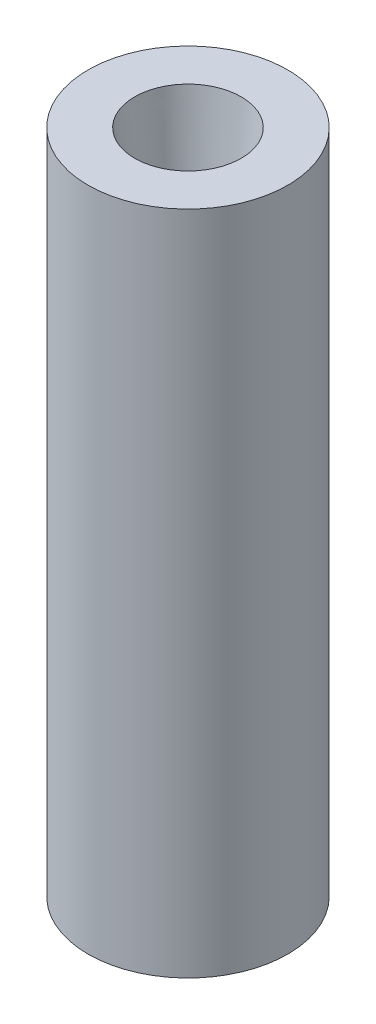
ISO-10303-21;
HEADER;
FILE_DESCRIPTION(('STEP AP214'),'2;1');
FILE_NAME('part.step','',(''),(''),'','','');
FILE_SCHEMA(('AUTOMOTIVE_DESIGN { 1 0 10303 214 1 1 1 1 }'));
ENDSEC;
DATA;
#1=APPLICATION_CONTEXT('core data for automotive mechanical design processes');
#2=APPLICATION_PROTOCOL_DEFINITION('international standard','automotive_design',2000,#1);
#3=PRODUCT_CONTEXT('',#1,'mechanical');
#4=PRODUCT('Part','Part','',(#3));
#5=PRODUCT_RELATED_PRODUCT_CATEGORY('part','',(#4));
#6=PRODUCT_DEFINITION_FORMATION('','',#4);
#7=PRODUCT_DEFINITION_CONTEXT('part definition',#1,'design');
#8=PRODUCT_DEFINITION('design','',#6,#7);
#9=PRODUCT_DEFINITION_SHAPE('','',#8);
#10=(LENGTH_UNIT() NAMED_UNIT(*) SI_UNIT(.MILLI.,.METRE.));
#11=(NAMED_UNIT(*) PLANE_ANGLE_UNIT() SI_UNIT($,.RADIAN.));
#12=(NAMED_UNIT(*) SI_UNIT($,.STERADIAN.) SOLID_ANGLE_UNIT());
#13=UNCERTAINTY_MEASURE_WITH_UNIT(LENGTH_MEASURE(1.E-05),#10,'distance_accuracy_value','');
#14=(GEOMETRIC_REPRESENTATION_CONTEXT(3) GLOBAL_UNCERTAINTY_ASSIGNED_CONTEXT((#13)) GLOBAL_UNIT_ASSIGNED_CONTEXT((#10,
#11,#12)) REPRESENTATION_CONTEXT('',''));
#15=CARTESIAN_POINT('',(0.,0.,0.));
#16=DIRECTION('',(0.,0.,1.));
#17=DIRECTION('',(1.,0.,0.));
#18=AXIS2_PLACEMENT_3D('',#15,#16,#17);
#19=CARTESIAN_POINT('',(0.,50.,0.));
#20=DIRECTION('',(0.,-1.,0.));
#21=DIRECTION('',(0.,0.,-1.));
#22=AXIS2_PLACEMENT_3D('',#19,#20,#21);
#23=CYLINDRICAL_SURFACE('',#22,7.5);
#24=CARTESIAN_POINT('',(0.,50.,0.));
#25=DIRECTION('',(0.,1.,0.));
#26=DIRECTION('',(0.,0.,1.));
#27=AXIS2_PLACEMENT_3D('',#24,#25,#26);
#28=CIRCLE('',#27,7.5);
#29=CARTESIAN_POINT('',(0.,50.,7.5));
#30=VERTEX_POINT('',#29);
#31=EDGE_CURVE('E12',#30,#30,#28,.T.);
#32=ORIENTED_EDGE('',*,*,#31,.F.);
#33=EDGE_LOOP('',(#32));
#34=FACE_BOUND('',#33,.T.);
#35=CARTESIAN_POINT('',(0.,0.,0.));
#36=DIRECTION('',(0.,1.,0.));
#37=DIRECTION('',(0.,0.,1.));
#38=AXIS2_PLACEMENT_3D('',#35,#36,#37);
#39=CIRCLE('',#38,7.5);
#40=CARTESIAN_POINT('',(0.,0.,7.5));
#41=VERTEX_POINT('',#40);
#42=EDGE_CURVE('E46',#41,#41,#39,.T.);
#43=ORIENTED_EDGE('',*,*,#42,.T.);
#44=EDGE_LOOP('',(#43));
#45=FACE_BOUND('',#44,.T.);
#46=ADVANCED_FACE('F43',(#34,#45),#23,.T.);
#47=CARTESIAN_POINT('',(0.,50.,0.));
#48=DIRECTION('',(0.,1.,0.));
#49=DIRECTION('',(0.,0.,1.));
#50=AXIS2_PLACEMENT_3D('',#47,#48,#49);
#51=PLANE('',#50);
#52=CARTESIAN_POINT('',(0.,50.,0.));
#53=DIRECTION('',(0.,1.,0.));
#54=DIRECTION('',(0.,0.,1.));
#55=AXIS2_PLACEMENT_3D('',#52,#53,#54);
#56=CIRCLE('',#55,4.);
#57=CARTESIAN_POINT('',(-3.97123031053972,50.,-0.478883932337059));
#58=VERTEX_POINT('',#57);
#59=EDGE_CURVE('E114',#58,#58,#56,.T.);
#60=ORIENTED_EDGE('',*,*,#59,.F.);
#61=EDGE_LOOP('',(#60));
#62=FACE_BOUND('',#61,.T.);
#63=ORIENTED_EDGE('',*,*,#31,.T.);
#64=EDGE_LOOP('',(#63));
#65=FACE_BOUND('',#64,.T.);
#66=ADVANCED_FACE('F137',(#62,#65),#51,.T.);
#67=CARTESIAN_POINT('',(0.,0.,0.));
#68=DIRECTION('',(0.,1.,0.));
#69=DIRECTION('',(0.,0.,1.));
#70=AXIS2_PLACEMENT_3D('',#67,#68,#69);
#71=PLANE('',#70);
#72=DIRECTION('',(-1.,0.,0.));
#73=VECTOR('',#72,1.);
#74=CARTESIAN_POINT('',(-1.725,0.,1.725));
#75=LINE('',#74,#73);
#76=CARTESIAN_POINT('',(1.725,0.,1.725));
#77=VERTEX_POINT('',#76);
#78=CARTESIAN_POINT('',(-1.725,0.,1.725));
#79=VERTEX_POINT('',#78);
#80=EDGE_CURVE('E92',#77,#79,#75,.T.);
#81=ORIENTED_EDGE('',*,*,#80,.F.);
#82=DIRECTION('',(0.,0.,1.));
#83=VECTOR('',#82,1.);
#84=CARTESIAN_POINT('',(1.725,0.,1.725));
#85=LINE('',#84,#83);
#86=CARTESIAN_POINT('',(1.725,0.,-1.725));
#87=VERTEX_POINT('',#86);
#88=EDGE_CURVE('E57',#87,#77,#85,.T.);
#89=ORIENTED_EDGE('',*,*,#88,.F.);
#90=DIRECTION('',(1.,0.,0.));
#91=VECTOR('',#90,1.);
#92=CARTESIAN_POINT('',(-1.725,0.,-1.725));
#93=LINE('',#92,#91);
#94=CARTESIAN_POINT('',(-1.725,0.,-1.725));
#95=VERTEX_POINT('',#94);
#96=EDGE_CURVE('E108',#95,#87,#93,.T.);
#97=ORIENTED_EDGE('',*,*,#96,.F.);
#98=DIRECTION('',(0.,0.,-1.));
#99=VECTOR('',#98,1.);
#100=CARTESIAN_POINT('',(-1.725,0.,1.725));
#101=LINE('',#100,#99);
#102=EDGE_CURVE('E116',#79,#95,#101,.T.);
#103=ORIENTED_EDGE('',*,*,#102,.F.);
#104=EDGE_LOOP('',(#81,#89,#97,#103));
#105=FACE_BOUND('',#104,.T.);
#106=ORIENTED_EDGE('',*,*,#42,.F.);
#107=EDGE_LOOP('',(#106));
#108=FACE_BOUND('',#107,.T.);
#109=ADVANCED_FACE('F122',(#105,#108),#71,.F.);
#110=CARTESIAN_POINT('',(1.725,25.,1.725));
#111=DIRECTION('',(1.,0.,0.));
#112=DIRECTION('',(0.,0.,-1.));
#113=AXIS2_PLACEMENT_3D('',#110,#111,#112);
#114=PLANE('',#113);
#115=ORIENTED_EDGE('',*,*,#88,.T.);
#116=DIRECTION('',(0.,-1.,0.));
#117=VECTOR('',#116,1.);
#118=CARTESIAN_POINT('',(1.725,25.,1.725));
#119=LINE('',#118,#117);
#120=CARTESIAN_POINT('',(1.725,25.,1.725));
#121=VERTEX_POINT('',#120);
#122=EDGE_CURVE('E80',#121,#77,#119,.T.);
#123=ORIENTED_EDGE('',*,*,#122,.F.);
#124=DIRECTION('',(0.,0.,1.));
#125=VECTOR('',#124,1.);
#126=CARTESIAN_POINT('',(1.725,25.,1.725));
#127=LINE('',#126,#125);
#128=CARTESIAN_POINT('',(1.725,25.,-1.725));
#129=VERTEX_POINT('',#128);
#130=EDGE_CURVE('E106',#129,#121,#127,.T.);
#131=ORIENTED_EDGE('',*,*,#130,.F.);
#132=DIRECTION('',(0.,-1.,0.));
#133=VECTOR('',#132,1.);
#134=CARTESIAN_POINT('',(1.725,25.,-1.725));
#135=LINE('',#134,#133);
#136=EDGE_CURVE('E65',#129,#87,#135,.T.);
#137=ORIENTED_EDGE('',*,*,#136,.T.);
#138=EDGE_LOOP('',(#115,#123,#131,#137));
#139=FACE_BOUND('',#138,.T.);
#140=ADVANCED_FACE('F127',(#139),#114,.F.);
#141=CARTESIAN_POINT('',(-1.725,25.,-1.725));
#142=DIRECTION('',(0.,0.,-1.));
#143=DIRECTION('',(-1.,0.,0.));
#144=AXIS2_PLACEMENT_3D('',#141,#142,#143);
#145=PLANE('',#144);
#146=ORIENTED_EDGE('',*,*,#96,.T.);
#147=ORIENTED_EDGE('',*,*,#136,.F.);
#148=DIRECTION('',(1.,0.,0.));
#149=VECTOR('',#148,1.);
#150=CARTESIAN_POINT('',(-1.725,25.,-1.725));
#151=LINE('',#150,#149);
#152=CARTESIAN_POINT('',(-1.725,25.,-1.725));
#153=VERTEX_POINT('',#152);
#154=EDGE_CURVE('E103',#153,#129,#151,.T.);
#155=ORIENTED_EDGE('',*,*,#154,.F.);
#156=DIRECTION('',(0.,-1.,0.));
#157=VECTOR('',#156,1.);
#158=CARTESIAN_POINT('',(-1.725,25.,-1.725));
#159=LINE('',#158,#157);
#160=EDGE_CURVE('E96',#153,#95,#159,.T.);
#161=ORIENTED_EDGE('',*,*,#160,.T.);
#162=EDGE_LOOP('',(#146,#147,#155,#161));
#163=FACE_BOUND('',#162,.T.);
#164=ADVANCED_FACE('F125',(#163),#145,.F.);
#165=CARTESIAN_POINT('',(-1.725,25.,1.725));
#166=DIRECTION('',(-1.,0.,0.));
#167=DIRECTION('',(0.,0.,1.));
#168=AXIS2_PLACEMENT_3D('',#165,#166,#167);
#169=PLANE('',#168);
#170=ORIENTED_EDGE('',*,*,#102,.T.);
#171=ORIENTED_EDGE('',*,*,#160,.F.);
#172=DIRECTION('',(0.,0.,-1.));
#173=VECTOR('',#172,1.);
#174=CARTESIAN_POINT('',(-1.725,25.,1.725));
#175=LINE('',#174,#173);
#176=CARTESIAN_POINT('',(-1.725,25.,1.725));
#177=VERTEX_POINT('',#176);
#178=EDGE_CURVE('E99',#177,#153,#175,.T.);
#179=ORIENTED_EDGE('',*,*,#178,.F.);
#180=DIRECTION('',(0.,-1.,0.));
#181=VECTOR('',#180,1.);
#182=CARTESIAN_POINT('',(-1.725,25.,1.725));
#183=LINE('',#182,#181);
#184=EDGE_CURVE('E85',#177,#79,#183,.T.);
#185=ORIENTED_EDGE('',*,*,#184,.T.);
#186=EDGE_LOOP('',(#170,#171,#179,#185));
#187=FACE_BOUND('',#186,.T.);
#188=ADVANCED_FACE('F100',(#187),#169,.F.);
#189=CARTESIAN_POINT('',(-1.725,25.,1.725));
#190=DIRECTION('',(0.,0.,1.));
#191=DIRECTION('',(1.,0.,0.));
#192=AXIS2_PLACEMENT_3D('',#189,#190,#191);
#193=PLANE('',#192);
#194=ORIENTED_EDGE('',*,*,#80,.T.);
#195=ORIENTED_EDGE('',*,*,#184,.F.);
#196=DIRECTION('',(-1.,0.,0.));
#197=VECTOR('',#196,1.);
#198=CARTESIAN_POINT('',(-1.725,25.,1.725));
#199=LINE('',#198,#197);
#200=EDGE_CURVE('E89',#121,#177,#199,.T.);
#201=ORIENTED_EDGE('',*,*,#200,.F.);
#202=ORIENTED_EDGE('',*,*,#122,.T.);
#203=EDGE_LOOP('',(#194,#195,#201,#202));
#204=FACE_BOUND('',#203,.T.);
#205=ADVANCED_FACE('F87',(#204),#193,.F.);
#206=CARTESIAN_POINT('',(0.,25.,0.));
#207=DIRECTION('',(0.,-1.,0.));
#208=DIRECTION('',(0.,0.,-1.));
#209=AXIS2_PLACEMENT_3D('',#206,#207,#208);
#210=PLANE('',#209);
#211=CARTESIAN_POINT('',(0.,25.,0.));
#212=DIRECTION('',(0.,1.,0.));
#213=DIRECTION('',(0.,0.,1.));
#214=AXIS2_PLACEMENT_3D('',#211,#212,#213);
#215=CIRCLE('',#214,1.5);
#216=CARTESIAN_POINT('',(-1.42334706868804,25.,-0.47337418820333));
#217=VERTEX_POINT('',#216);
#218=EDGE_CURVE('E172',#217,#217,#215,.T.);
#219=ORIENTED_EDGE('',*,*,#218,.T.);
#220=EDGE_LOOP('',(#219));
#221=FACE_BOUND('',#220,.T.);
#222=ORIENTED_EDGE('',*,*,#130,.T.);
#223=ORIENTED_EDGE('',*,*,#200,.T.);
#224=ORIENTED_EDGE('',*,*,#178,.T.);
#225=ORIENTED_EDGE('',*,*,#154,.T.);
#226=EDGE_LOOP('',(#222,#223,#224,#225));
#227=FACE_BOUND('',#226,.T.);
#228=ADVANCED_FACE('F105',(#221,#227),#210,.T.);
#229=CARTESIAN_POINT('',(-1.42334706868804,25.,-0.47337418820333));
#230=CARTESIAN_POINT('',(-3.97123031053972,50.,-0.478883932337059));
#231=CARTESIAN_POINT('',(-2.3700954450947,25.,2.37331994917275));
#232=CARTESIAN_POINT('',(-4.92899817521384,50.,7.46357668874239));
#233=CARTESIAN_POINT('',(0.47659869228138,25.,3.32006832557941));
#234=CARTESIAN_POINT('',(3.01346244586561,50.,8.4213445534165));
#235=CARTESIAN_POINT('',(1.42334706868804,25.,0.473374188203331));
#236=CARTESIAN_POINT('',(3.97123031053972,50.,0.478883932337055));
#237=CARTESIAN_POINT('',(2.3700954450947,25.,-2.37331994917275));
#238=CARTESIAN_POINT('',(4.92899817521383,50.,-7.46357668874238));
#239=CARTESIAN_POINT('',(-0.476598692281379,25.,-3.32006832557941));
#240=CARTESIAN_POINT('',(-3.01346244586561,50.,-8.42134455341649));
#241=CARTESIAN_POINT('',(-1.42334706868804,25.,-0.47337418820333));
#242=CARTESIAN_POINT('',(-3.97123031053972,50.,-0.478883932337059));
#243=(BOUNDED_SURFACE() B_SPLINE_SURFACE(3,1,((#229,#230),(#231,#232),(#233,#234),(#235,#236),
(#237,#238),(#239,#240),(#241,#242)),.UNSPECIFIED.,.T.,.F.,.F.) B_SPLINE_SURFACE_WITH_KNOTS((4,
3,4),(2,2),(0.,0.5,1.),(0.,1.),
.UNSPECIFIED.) GEOMETRIC_REPRESENTATION_ITEM() RATIONAL_B_SPLINE_SURFACE(((1.,1.),
(0.333333333333334,0.333333333333333),(0.333333333333334,0.333333333333333),(1.,1.),
(0.333333333333333,0.333333333333333),(0.333333333333333,0.333333333333333),(1.,1.))) REPRESENTATION_ITEM('') SURFACE());
#244=CARTESIAN_POINT('',(-1.42334706868804,25.,-0.47337418820333));
#245=CARTESIAN_POINT('',(-1.449887519124,25.2604166666667,-0.473431581371389));
#246=CARTESIAN_POINT('',(-1.47642796955995,25.5208333333333,-0.473488974539449));
#247=CARTESIAN_POINT('',(-1.52950887043186,26.0416666666667,-0.473603760875568));
#248=CARTESIAN_POINT('',(-1.55604932086782,26.3020833333333,-0.473661154043628));
#249=CARTESIAN_POINT('',(-1.60913022173973,26.8229166666667,-0.473775940379747));
#250=CARTESIAN_POINT('',(-1.63567067217568,27.0833333333333,-0.473833333547807));
#251=CARTESIAN_POINT('',(-1.68875157304759,27.6041666666667,-0.473948119883926));
#252=CARTESIAN_POINT('',(-1.71529202348355,27.8645833333333,-0.474005513051986));
#253=CARTESIAN_POINT('',(-1.76837292435546,28.3854166666667,-0.474120299388105));
#254=CARTESIAN_POINT('',(-1.79491337479141,28.6458333333333,-0.474177692556165));
#255=CARTESIAN_POINT('',(-1.84799427566332,29.1666666666667,-0.474292478892285));
#256=CARTESIAN_POINT('',(-1.87453472609928,29.4270833333333,-0.474349872060344));
#257=CARTESIAN_POINT('',(-1.92761562697119,29.9479166666667,-0.474464658396464));
#258=CARTESIAN_POINT('',(-1.95415607740714,30.2083333333333,-0.474522051564523));
#259=CARTESIAN_POINT('',(-2.00723697827905,30.7291666666667,-0.474636837900643));
#260=CARTESIAN_POINT('',(-2.03377742871501,30.9895833333333,-0.474694231068702));
#261=CARTESIAN_POINT('',(-2.08685832958691,31.5104166666667,-0.474809017404822));
#262=CARTESIAN_POINT('',(-2.11339878002287,31.7708333333333,-0.474866410572881));
#263=CARTESIAN_POINT('',(-2.16647968089478,32.2916666666667,-0.474981196909001));
#264=CARTESIAN_POINT('',(-2.19302013133074,32.5520833333333,-0.47503859007706));
#265=CARTESIAN_POINT('',(-2.24610103220265,33.0729166666667,-0.47515337641318));
#266=CARTESIAN_POINT('',(-2.2726414826386,33.3333333333333,-0.475210769581239));
#267=CARTESIAN_POINT('',(-2.32572238351051,33.8541666666667,-0.475325555917359));
#268=CARTESIAN_POINT('',(-2.35226283394647,34.1145833333333,-0.475382949085418));
#269=CARTESIAN_POINT('',(-2.40534373481838,34.6354166666667,-0.475497735421538));
#270=CARTESIAN_POINT('',(-2.43188418525433,34.8958333333333,-0.475555128589597));
#271=CARTESIAN_POINT('',(-2.48496508612624,35.4166666666667,-0.475669914925717));
#272=CARTESIAN_POINT('',(-2.5115055365622,35.6770833333333,-0.475727308093777));
#273=CARTESIAN_POINT('',(-2.56458643743411,36.1979166666667,-0.475842094429896));
#274=CARTESIAN_POINT('',(-2.59112688787006,36.4583333333333,-0.475899487597956));
#275=CARTESIAN_POINT('',(-2.64420778874197,36.9791666666667,-0.476014273934075));
#276=CARTESIAN_POINT('',(-2.67074823917792,37.2395833333333,-0.476071667102134));
#277=CARTESIAN_POINT('',(-2.72382914004983,37.7604166666667,-0.476186453438254));
#278=CARTESIAN_POINT('',(-2.75036959048579,38.0208333333333,-0.476243846606314));
#279=CARTESIAN_POINT('',(-2.8034504913577,38.5416666666667,-0.476358632942433));
#280=CARTESIAN_POINT('',(-2.82999094179366,38.8020833333333,-0.476416026110493));
#281=CARTESIAN_POINT('',(-2.88307184266556,39.3229166666667,-0.476530812446612));
#282=CARTESIAN_POINT('',(-2.90961229310152,39.5833333333333,-0.476588205614672));
#283=CARTESIAN_POINT('',(-2.96269319397343,40.1041666666667,-0.476702991950791));
#284=CARTESIAN_POINT('',(-2.98923364440938,40.3645833333333,-0.476760385118851));
#285=CARTESIAN_POINT('',(-3.04231454528129,40.8854166666667,-0.47687517145497));
#286=CARTESIAN_POINT('',(-3.06885499571725,41.1458333333333,-0.47693256462303));
#287=CARTESIAN_POINT('',(-3.12193589658916,41.6666666666667,-0.477047350959149));
#288=CARTESIAN_POINT('',(-3.14847634702511,41.9270833333333,-0.477104744127209));
#289=CARTESIAN_POINT('',(-3.20155724789702,42.4479166666667,-0.477219530463328));
#290=CARTESIAN_POINT('',(-3.22809769833298,42.7083333333333,-0.477276923631388));
#291=CARTESIAN_POINT('',(-3.28117859920489,43.2291666666667,-0.477391709967507));
#292=CARTESIAN_POINT('',(-3.30771904964084,43.4895833333333,-0.477449103135567));
#293=CARTESIAN_POINT('',(-3.36079995051276,44.0104166666667,-0.477563889471686));
#294=CARTESIAN_POINT('',(-3.38734040094871,44.2708333333333,-0.477621282639746));
#295=CARTESIAN_POINT('',(-3.44042130182062,44.7916666666667,-0.477736068975865));
#296=CARTESIAN_POINT('',(-3.46696175225657,45.0520833333333,-0.477793462143925));
#297=CARTESIAN_POINT('',(-3.52004265312848,45.5729166666667,-0.477908248480044));
#298=CARTESIAN_POINT('',(-3.54658310356444,45.8333333333333,-0.477965641648104));
#299=CARTESIAN_POINT('',(-3.59966400443635,46.3541666666667,-0.478080427984223));
#300=CARTESIAN_POINT('',(-3.6262044548723,46.6145833333333,-0.478137821152283));
#301=CARTESIAN_POINT('',(-3.67928535574421,47.1354166666667,-0.478252607488402));
#302=CARTESIAN_POINT('',(-3.70582580618017,47.3958333333333,-0.478310000656462));
#303=CARTESIAN_POINT('',(-3.75890670705208,47.9166666666667,-0.478424786992581));
#304=CARTESIAN_POINT('',(-3.78544715748803,48.1770833333333,-0.478482180160641));
#305=CARTESIAN_POINT('',(-3.83852805835994,48.6979166666667,-0.47859696649676));
#306=CARTESIAN_POINT('',(-3.8650685087959,48.9583333333333,-0.47865435966482));
#307=CARTESIAN_POINT('',(-3.91814940966781,49.4791666666667,-0.478769146000939));
#308=CARTESIAN_POINT('',(-3.94468986010376,49.7395833333333,-0.478826539168999));
#309=CARTESIAN_POINT('',(-3.97123031053972,50.,-0.478883932337059));
#310=B_SPLINE_CURVE_WITH_KNOTS('',3,(#244,#245,#246,#247,#248,#249,#250,#251,#252,#253,#254,
#255,#256,#257,#258,#259,#260,#261,#262,#263,#264,#265,#266,#267,#268,#269,#270,#271,#272,#273,
#274,#275,#276,#277,#278,#279,#280,#281,#282,#283,#284,#285,#286,#287,#288,#289,#290,#291,#292,
#293,#294,#295,#296,#297,#298,#299,#300,#301,#302,#303,#304,#305,#306,#307,#308,#309),
.UNSPECIFIED.,.F.,.F.,(4,2,2,2,2,2,2,2,2,2,2,2,2,2,2,2,2,2,2,2,2,2,2,2,2,2,2,2,2,2,2,2,4),(0.,
0.785296855800323,1.57059371160064,2.35589056740097,3.14118742320129,3.92648427900161,
4.71178113480193,5.49707799060226,6.28237484640258,7.0676717022029,7.85296855800322,
8.63826541380355,9.42356226960387,10.2088591254042,10.9941559812045,11.7794528370048,
12.5647496928052,13.3500465486055,14.1353434044058,14.9206402602061,15.7059371160064,
16.4912339718068,17.2765308276071,18.0618276834074,18.8471245392077,19.6324213950081,
20.4177182508084,21.2030151066087,21.988311962409,22.7736088182094,23.5589056740097,
24.34420252981,25.1294993856103),.UNSPECIFIED.);
#311=EDGE_CURVE('BSEAM156',#217,#58,#310,.T.);
#312=ORIENTED_EDGE('',*,*,#218,.F.);
#313=ORIENTED_EDGE('',*,*,#59,.T.);
#314=ORIENTED_EDGE('',*,*,#311,.T.);
#315=ORIENTED_EDGE('',*,*,#311,.F.);
#316=EDGE_LOOP('',(#312,#314,#313,#315));
#317=FACE_BOUND('',#316,.T.);
#318=ADVANCED_FACE('F156',(#317),#243,.F.);
#319=CLOSED_SHELL('',(#46,#66,#109,#140,#164,#188,#205,#228,#318));
#320=MANIFOLD_SOLID_BREP('B2',#319);
#321=ADVANCED_BREP_SHAPE_REPRESENTATION('',(#18,#320),#14);
#322=SHAPE_DEFINITION_REPRESENTATION(#9,#321);
ENDSEC;
END-ISO-10303-21;
